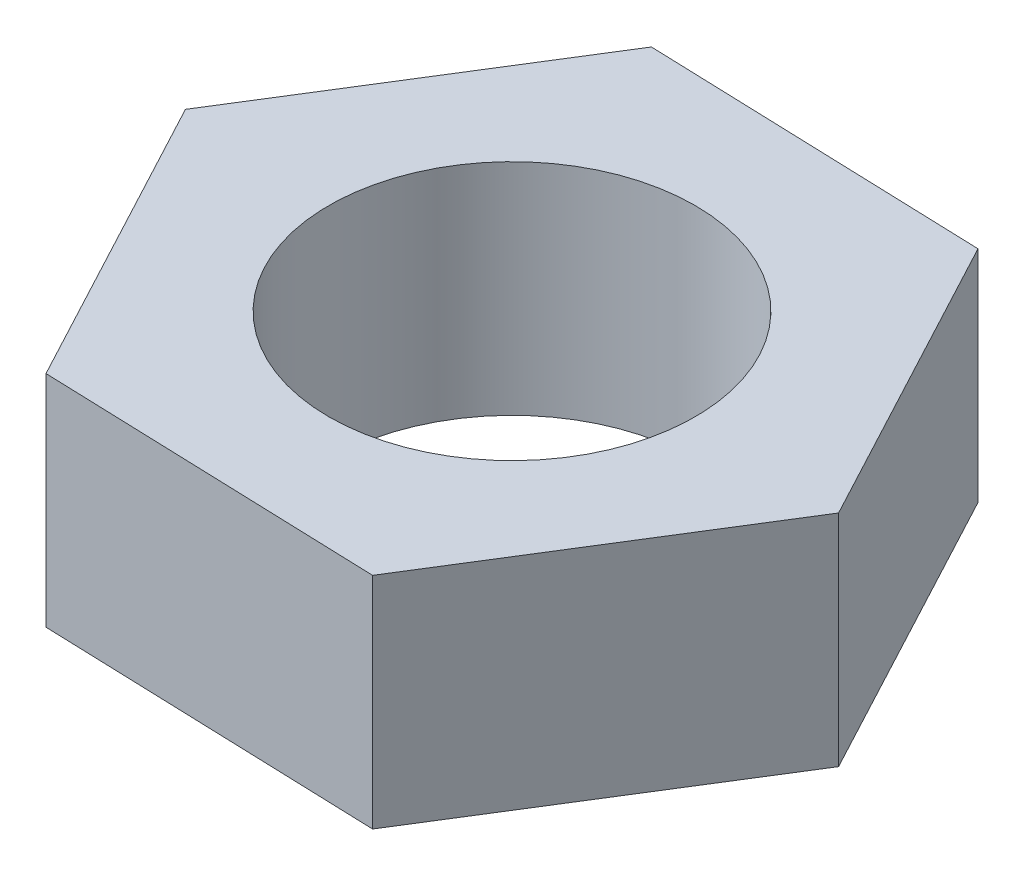
ISO-10303-21;
HEADER;
FILE_DESCRIPTION(('STEP AP214'),'2;1');
FILE_NAME('part.step','',(''),(''),'','','');
FILE_SCHEMA(('AUTOMOTIVE_DESIGN { 1 0 10303 214 1 1 1 1 }'));
ENDSEC;
DATA;
#1=APPLICATION_CONTEXT('core data for automotive mechanical design processes');
#2=APPLICATION_PROTOCOL_DEFINITION('international standard','automotive_design',2000,#1);
#3=PRODUCT_CONTEXT('',#1,'mechanical');
#4=PRODUCT('Part','Part','',(#3));
#5=PRODUCT_RELATED_PRODUCT_CATEGORY('part','',(#4));
#6=PRODUCT_DEFINITION_FORMATION('','',#4);
#7=PRODUCT_DEFINITION_CONTEXT('part definition',#1,'design');
#8=PRODUCT_DEFINITION('design','',#6,#7);
#9=PRODUCT_DEFINITION_SHAPE('','',#8);
#10=(LENGTH_UNIT() NAMED_UNIT(*) SI_UNIT(.MILLI.,.METRE.));
#11=(NAMED_UNIT(*) PLANE_ANGLE_UNIT() SI_UNIT($,.RADIAN.));
#12=(NAMED_UNIT(*) SI_UNIT($,.STERADIAN.) SOLID_ANGLE_UNIT());
#13=UNCERTAINTY_MEASURE_WITH_UNIT(LENGTH_MEASURE(1.E-05),#10,'distance_accuracy_value','');
#14=(GEOMETRIC_REPRESENTATION_CONTEXT(3) GLOBAL_UNCERTAINTY_ASSIGNED_CONTEXT((#13)) GLOBAL_UNIT_ASSIGNED_CONTEXT((#10,
#11,#12)) REPRESENTATION_CONTEXT('',''));
#15=CARTESIAN_POINT('',(0.,0.,0.));
#16=DIRECTION('',(0.,0.,1.));
#17=DIRECTION('',(1.,0.,0.));
#18=AXIS2_PLACEMENT_3D('',#15,#16,#17);
#19=CARTESIAN_POINT('',(0.,0.,0.));
#20=DIRECTION('',(0.,1.,0.));
#21=DIRECTION('',(0.,0.,1.));
#22=AXIS2_PLACEMENT_3D('',#19,#20,#21);
#23=CYLINDRICAL_SURFACE('',#22,2.5);
#24=CARTESIAN_POINT('',(0.,0.,0.));
#25=DIRECTION('',(0.,1.,0.));
#26=DIRECTION('',(0.,0.,1.));
#27=AXIS2_PLACEMENT_3D('',#24,#25,#26);
#28=CIRCLE('',#27,2.5);
#29=CARTESIAN_POINT('',(0.,0.,2.5));
#30=VERTEX_POINT('',#29);
#31=EDGE_CURVE('E127',#30,#30,#28,.T.);
#32=ORIENTED_EDGE('',*,*,#31,.F.);
#33=EDGE_LOOP('',(#32));
#34=FACE_BOUND('',#33,.T.);
#35=CARTESIAN_POINT('',(0.,3.,0.));
#36=DIRECTION('',(0.,1.,0.));
#37=DIRECTION('',(0.,0.,1.));
#38=AXIS2_PLACEMENT_3D('',#35,#36,#37);
#39=CIRCLE('',#38,2.5);
#40=CARTESIAN_POINT('',(0.,3.,2.5));
#41=VERTEX_POINT('',#40);
#42=EDGE_CURVE('E41',#41,#41,#39,.F.);
#43=ORIENTED_EDGE('',*,*,#42,.F.);
#44=EDGE_LOOP('',(#43));
#45=FACE_BOUND('',#44,.T.);
#46=ADVANCED_FACE('F37',(#34,#45),#23,.F.);
#47=CARTESIAN_POINT('',(2.17224786258142,3.,4.07610997850203));
#48=DIRECTION('',(-0.848548322984265,0.,-0.529117891930136));
#49=DIRECTION('',(-0.529117891930136,0.,0.848548322984266));
#50=AXIS2_PLACEMENT_3D('',#47,#48,#49);
#51=PLANE('',#50);
#52=DIRECTION('',(0.529117891930136,0.,-0.848548322984266));
#53=VECTOR('',#52,1.);
#54=CARTESIAN_POINT('',(2.17224786258142,0.,4.07610997850203));
#55=LINE('',#54,#53);
#56=CARTESIAN_POINT('',(2.17224786258142,0.,4.07610997850203));
#57=VERTEX_POINT('',#56);
#58=CARTESIAN_POINT('',(4.61613872129271,0.,0.156833156939058));
#59=VERTEX_POINT('',#58);
#60=EDGE_CURVE('E123',#57,#59,#55,.T.);
#61=ORIENTED_EDGE('',*,*,#60,.T.);
#62=DIRECTION('',(0.,-1.,0.));
#63=VECTOR('',#62,1.);
#64=CARTESIAN_POINT('',(4.61613872129271,3.,0.156833156939058));
#65=LINE('',#64,#63);
#66=CARTESIAN_POINT('',(4.61613872129271,3.,0.156833156939058));
#67=VERTEX_POINT('',#66);
#68=EDGE_CURVE('E11',#67,#59,#65,.T.);
#69=ORIENTED_EDGE('',*,*,#68,.F.);
#70=DIRECTION('',(0.529117891930136,0.,-0.848548322984266));
#71=VECTOR('',#70,1.);
#72=CARTESIAN_POINT('',(2.17224786258142,3.,4.07610997850203));
#73=LINE('',#72,#71);
#74=CARTESIAN_POINT('',(2.17224786258142,3.,4.07610997850203));
#75=VERTEX_POINT('',#74);
#76=EDGE_CURVE('E90',#75,#67,#73,.T.);
#77=ORIENTED_EDGE('',*,*,#76,.F.);
#78=DIRECTION('',(0.,-1.,0.));
#79=VECTOR('',#78,1.);
#80=CARTESIAN_POINT('',(2.17224786258142,3.,4.07610997850203));
#81=LINE('',#80,#79);
#82=EDGE_CURVE('E119',#75,#57,#81,.T.);
#83=ORIENTED_EDGE('',*,*,#82,.T.);
#84=EDGE_LOOP('',(#61,#69,#77,#83));
#85=FACE_BOUND('',#84,.T.);
#86=ADVANCED_FACE('F39',(#85),#51,.F.);
#87=CARTESIAN_POINT('',(4.61613872129271,3.,0.156833156939058));
#88=DIRECTION('',(-0.8825036975005,0.,0.470305458077989));
#89=DIRECTION('',(0.470305458077989,0.,0.8825036975005));
#90=AXIS2_PLACEMENT_3D('',#87,#88,#89);
#91=PLANE('',#90);
#92=DIRECTION('',(-0.470305458077989,0.,-0.882503697500499));
#93=VECTOR('',#92,1.);
#94=CARTESIAN_POINT('',(4.61613872129271,0.,0.156833156939058));
#95=LINE('',#94,#93);
#96=CARTESIAN_POINT('',(2.44389085871129,0.,-3.91927682156297));
#97=VERTEX_POINT('',#96);
#98=EDGE_CURVE('E126',#59,#97,#95,.T.);
#99=ORIENTED_EDGE('',*,*,#98,.T.);
#100=DIRECTION('',(0.,-1.,0.));
#101=VECTOR('',#100,1.);
#102=CARTESIAN_POINT('',(2.44389085871129,3.,-3.91927682156297));
#103=LINE('',#102,#101);
#104=CARTESIAN_POINT('',(2.44389085871129,3.,-3.91927682156297));
#105=VERTEX_POINT('',#104);
#106=EDGE_CURVE('E47',#105,#97,#103,.T.);
#107=ORIENTED_EDGE('',*,*,#106,.F.);
#108=DIRECTION('',(-0.470305458077989,0.,-0.882503697500499));
#109=VECTOR('',#108,1.);
#110=CARTESIAN_POINT('',(4.61613872129271,3.,0.156833156939058));
#111=LINE('',#110,#109);
#112=EDGE_CURVE('E176',#67,#105,#111,.T.);
#113=ORIENTED_EDGE('',*,*,#112,.F.);
#114=ORIENTED_EDGE('',*,*,#68,.T.);
#115=EDGE_LOOP('',(#99,#107,#113,#114));
#116=FACE_BOUND('',#115,.T.);
#117=ADVANCED_FACE('F164',(#116),#91,.F.);
#118=CARTESIAN_POINT('',(2.44389085871129,3.,-3.91927682156297));
#119=DIRECTION('',(-0.0339553745162339,0.,0.999423350008124));
#120=DIRECTION('',(0.999423350008125,0.,0.0339553745162339));
#121=AXIS2_PLACEMENT_3D('',#118,#119,#120);
#122=PLANE('',#121);
#123=DIRECTION('',(-0.999423350008125,0.,-0.0339553745162339));
#124=VECTOR('',#123,1.);
#125=CARTESIAN_POINT('',(2.44389085871129,0.,-3.91927682156297));
#126=LINE('',#125,#124);
#127=CARTESIAN_POINT('',(-2.17224786258142,0.,-4.07610997850203));
#128=VERTEX_POINT('',#127);
#129=EDGE_CURVE('E129',#97,#128,#126,.T.);
#130=ORIENTED_EDGE('',*,*,#129,.T.);
#131=DIRECTION('',(0.,-1.,0.));
#132=VECTOR('',#131,1.);
#133=CARTESIAN_POINT('',(-2.17224786258142,3.,-4.07610997850203));
#134=LINE('',#133,#132);
#135=CARTESIAN_POINT('',(-2.17224786258142,3.,-4.07610997850203));
#136=VERTEX_POINT('',#135);
#137=EDGE_CURVE('E114',#136,#128,#134,.T.);
#138=ORIENTED_EDGE('',*,*,#137,.F.);
#139=DIRECTION('',(-0.999423350008125,0.,-0.0339553745162339));
#140=VECTOR('',#139,1.);
#141=CARTESIAN_POINT('',(2.44389085871129,3.,-3.91927682156297));
#142=LINE('',#141,#140);
#143=EDGE_CURVE('E105',#105,#136,#142,.T.);
#144=ORIENTED_EDGE('',*,*,#143,.F.);
#145=ORIENTED_EDGE('',*,*,#106,.T.);
#146=EDGE_LOOP('',(#130,#138,#144,#145));
#147=FACE_BOUND('',#146,.T.);
#148=ADVANCED_FACE('F141',(#147),#122,.F.);
#149=CARTESIAN_POINT('',(-2.17224786258142,3.,-4.07610997850203));
#150=DIRECTION('',(0.848548322984266,0.,0.529117891930135));
#151=DIRECTION('',(0.529117891930135,0.,-0.848548322984266));
#152=AXIS2_PLACEMENT_3D('',#149,#150,#151);
#153=PLANE('',#152);
#154=DIRECTION('',(-0.529117891930135,0.,0.848548322984266));
#155=VECTOR('',#154,1.);
#156=CARTESIAN_POINT('',(-2.17224786258142,0.,-4.07610997850203));
#157=LINE('',#156,#155);
#158=CARTESIAN_POINT('',(-4.6161387212927,0.,-0.156833156939058));
#159=VERTEX_POINT('',#158);
#160=EDGE_CURVE('E113',#128,#159,#157,.T.);
#161=ORIENTED_EDGE('',*,*,#160,.T.);
#162=DIRECTION('',(0.,-1.,0.));
#163=VECTOR('',#162,1.);
#164=CARTESIAN_POINT('',(-4.6161387212927,3.,-0.156833156939058));
#165=LINE('',#164,#163);
#166=CARTESIAN_POINT('',(-4.6161387212927,3.,-0.156833156939058));
#167=VERTEX_POINT('',#166);
#168=EDGE_CURVE('E110',#167,#159,#165,.T.);
#169=ORIENTED_EDGE('',*,*,#168,.F.);
#170=DIRECTION('',(-0.529117891930135,0.,0.848548322984266));
#171=VECTOR('',#170,1.);
#172=CARTESIAN_POINT('',(-2.17224786258142,3.,-4.07610997850203));
#173=LINE('',#172,#171);
#174=EDGE_CURVE('E98',#136,#167,#173,.T.);
#175=ORIENTED_EDGE('',*,*,#174,.F.);
#176=ORIENTED_EDGE('',*,*,#137,.T.);
#177=EDGE_LOOP('',(#161,#169,#175,#176));
#178=FACE_BOUND('',#177,.T.);
#179=ADVANCED_FACE('F111',(#178),#153,.F.);
#180=CARTESIAN_POINT('',(-4.6161387212927,3.,-0.156833156939058));
#181=DIRECTION('',(0.8825036975005,0.,-0.470305458077989));
#182=DIRECTION('',(-0.470305458077989,0.,-0.8825036975005));
#183=AXIS2_PLACEMENT_3D('',#180,#181,#182);
#184=PLANE('',#183);
#185=DIRECTION('',(0.470305458077989,0.,0.882503697500499));
#186=VECTOR('',#185,1.);
#187=CARTESIAN_POINT('',(-4.6161387212927,0.,-0.156833156939058));
#188=LINE('',#187,#186);
#189=CARTESIAN_POINT('',(-2.44389085871129,0.,3.91927682156297));
#190=VERTEX_POINT('',#189);
#191=EDGE_CURVE('E78',#159,#190,#188,.T.);
#192=ORIENTED_EDGE('',*,*,#191,.T.);
#193=DIRECTION('',(0.,-1.,0.));
#194=VECTOR('',#193,1.);
#195=CARTESIAN_POINT('',(-2.44389085871129,3.,3.91927682156297));
#196=LINE('',#195,#194);
#197=CARTESIAN_POINT('',(-2.44389085871129,3.,3.91927682156297));
#198=VERTEX_POINT('',#197);
#199=EDGE_CURVE('E115',#198,#190,#196,.T.);
#200=ORIENTED_EDGE('',*,*,#199,.F.);
#201=DIRECTION('',(0.470305458077989,0.,0.882503697500499));
#202=VECTOR('',#201,1.);
#203=CARTESIAN_POINT('',(-4.6161387212927,3.,-0.156833156939058));
#204=LINE('',#203,#202);
#205=EDGE_CURVE('E103',#167,#198,#204,.T.);
#206=ORIENTED_EDGE('',*,*,#205,.F.);
#207=ORIENTED_EDGE('',*,*,#168,.T.);
#208=EDGE_LOOP('',(#192,#200,#206,#207));
#209=FACE_BOUND('',#208,.T.);
#210=ADVANCED_FACE('F117',(#209),#184,.F.);
#211=CARTESIAN_POINT('',(-2.44389085871129,3.,3.91927682156297));
#212=DIRECTION('',(0.0339553745162339,0.,-0.999423350008124));
#213=DIRECTION('',(-0.999423350008125,0.,-0.0339553745162339));
#214=AXIS2_PLACEMENT_3D('',#211,#212,#213);
#215=PLANE('',#214);
#216=DIRECTION('',(0.999423350008125,0.,0.0339553745162339));
#217=VECTOR('',#216,1.);
#218=CARTESIAN_POINT('',(-2.44389085871129,0.,3.91927682156297));
#219=LINE('',#218,#217);
#220=EDGE_CURVE('E84',#190,#57,#219,.T.);
#221=ORIENTED_EDGE('',*,*,#220,.T.);
#222=ORIENTED_EDGE('',*,*,#82,.F.);
#223=DIRECTION('',(0.999423350008125,0.,0.0339553745162339));
#224=VECTOR('',#223,1.);
#225=CARTESIAN_POINT('',(-2.44389085871129,3.,3.91927682156297));
#226=LINE('',#225,#224);
#227=EDGE_CURVE('E55',#198,#75,#226,.T.);
#228=ORIENTED_EDGE('',*,*,#227,.F.);
#229=ORIENTED_EDGE('',*,*,#199,.T.);
#230=EDGE_LOOP('',(#221,#222,#228,#229));
#231=FACE_BOUND('',#230,.T.);
#232=ADVANCED_FACE('F148',(#231),#215,.F.);
#233=CARTESIAN_POINT('',(0.,3.,0.));
#234=DIRECTION('',(0.,1.,0.));
#235=DIRECTION('',(0.,0.,1.));
#236=AXIS2_PLACEMENT_3D('',#233,#234,#235);
#237=PLANE('',#236);
#238=ORIENTED_EDGE('',*,*,#76,.T.);
#239=ORIENTED_EDGE('',*,*,#112,.T.);
#240=ORIENTED_EDGE('',*,*,#143,.T.);
#241=ORIENTED_EDGE('',*,*,#174,.T.);
#242=ORIENTED_EDGE('',*,*,#205,.T.);
#243=ORIENTED_EDGE('',*,*,#227,.T.);
#244=EDGE_LOOP('',(#238,#239,#240,#241,#242,#243));
#245=FACE_BOUND('',#244,.T.);
#246=ORIENTED_EDGE('',*,*,#42,.T.);
#247=EDGE_LOOP('',(#246));
#248=FACE_BOUND('',#247,.T.);
#249=ADVANCED_FACE('F100',(#245,#248),#237,.T.);
#250=CARTESIAN_POINT('',(0.,0.,0.));
#251=DIRECTION('',(0.,1.,0.));
#252=DIRECTION('',(0.,0.,1.));
#253=AXIS2_PLACEMENT_3D('',#250,#251,#252);
#254=PLANE('',#253);
#255=ORIENTED_EDGE('',*,*,#31,.T.);
#256=EDGE_LOOP('',(#255));
#257=FACE_BOUND('',#256,.T.);
#258=ORIENTED_EDGE('',*,*,#60,.F.);
#259=ORIENTED_EDGE('',*,*,#220,.F.);
#260=ORIENTED_EDGE('',*,*,#191,.F.);
#261=ORIENTED_EDGE('',*,*,#160,.F.);
#262=ORIENTED_EDGE('',*,*,#129,.F.);
#263=ORIENTED_EDGE('',*,*,#98,.F.);
#264=EDGE_LOOP('',(#258,#259,#260,#261,#262,#263));
#265=FACE_BOUND('',#264,.T.);
#266=ADVANCED_FACE('F145',(#257,#265),#254,.F.);
#267=CLOSED_SHELL('',(#46,#86,#117,#148,#179,#210,#232,#249,#266));
#268=MANIFOLD_SOLID_BREP('B2',#267);
#269=ADVANCED_BREP_SHAPE_REPRESENTATION('',(#18,#268),#14);
#270=SHAPE_DEFINITION_REPRESENTATION(#9,#269);
ENDSEC;
END-ISO-10303-21;
